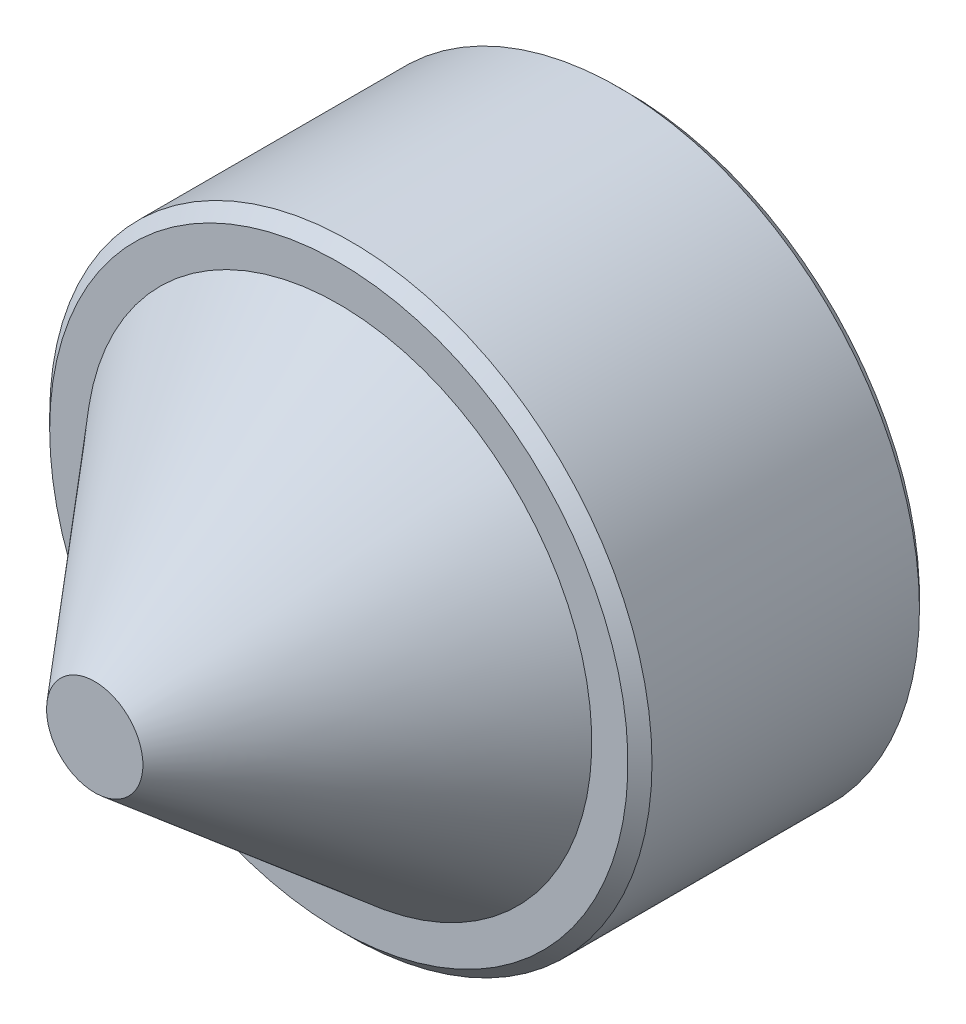
ISO-10303-21;
HEADER;
FILE_DESCRIPTION(('STEP AP214'),'2;1');
FILE_NAME('part.step','',(''),(''),'','','');
FILE_SCHEMA(('AUTOMOTIVE_DESIGN { 1 0 10303 214 1 1 1 1 }'));
ENDSEC;
DATA;
#1=APPLICATION_CONTEXT('core data for automotive mechanical design processes');
#2=APPLICATION_PROTOCOL_DEFINITION('international standard','automotive_design',2000,#1);
#3=PRODUCT_CONTEXT('',#1,'mechanical');
#4=PRODUCT('Part','Part','',(#3));
#5=PRODUCT_RELATED_PRODUCT_CATEGORY('part','',(#4));
#6=PRODUCT_DEFINITION_FORMATION('','',#4);
#7=PRODUCT_DEFINITION_CONTEXT('part definition',#1,'design');
#8=PRODUCT_DEFINITION('design','',#6,#7);
#9=PRODUCT_DEFINITION_SHAPE('','',#8);
#10=(LENGTH_UNIT() NAMED_UNIT(*) SI_UNIT(.MILLI.,.METRE.));
#11=(NAMED_UNIT(*) PLANE_ANGLE_UNIT() SI_UNIT($,.RADIAN.));
#12=(NAMED_UNIT(*) SI_UNIT($,.STERADIAN.) SOLID_ANGLE_UNIT());
#13=UNCERTAINTY_MEASURE_WITH_UNIT(LENGTH_MEASURE(1.E-05),#10,'distance_accuracy_value','');
#14=(GEOMETRIC_REPRESENTATION_CONTEXT(3) GLOBAL_UNCERTAINTY_ASSIGNED_CONTEXT((#13)) GLOBAL_UNIT_ASSIGNED_CONTEXT((#10,
#11,#12)) REPRESENTATION_CONTEXT('',''));
#15=CARTESIAN_POINT('',(0.,0.,0.));
#16=DIRECTION('',(0.,0.,1.));
#17=DIRECTION('',(1.,0.,0.));
#18=AXIS2_PLACEMENT_3D('',#15,#16,#17);
#19=CARTESIAN_POINT('',(0.,0.,0.));
#20=DIRECTION('',(0.,0.,1.));
#21=DIRECTION('',(1.,0.,0.));
#22=AXIS2_PLACEMENT_3D('',#19,#20,#21);
#23=PLANE('',#22);
#24=CARTESIAN_POINT('',(0.,0.,0.));
#25=DIRECTION('',(0.,0.,1.));
#26=DIRECTION('',(1.,0.,0.));
#27=AXIS2_PLACEMENT_3D('',#24,#25,#26);
#28=CIRCLE('',#27,11.);
#29=CARTESIAN_POINT('',(-11.,0.,0.));
#30=VERTEX_POINT('',#29);
#31=EDGE_CURVE('E46',#30,#30,#28,.F.);
#32=ORIENTED_EDGE('',*,*,#31,.F.);
#33=EDGE_LOOP('',(#32));
#34=FACE_BOUND('',#33,.T.);
#35=CARTESIAN_POINT('',(0.,0.,0.));
#36=DIRECTION('',(0.,0.,-1.));
#37=DIRECTION('',(-1.,0.,0.));
#38=AXIS2_PLACEMENT_3D('',#35,#36,#37);
#39=CIRCLE('',#38,12.1);
#40=CARTESIAN_POINT('',(-12.1,0.,0.));
#41=VERTEX_POINT('',#40);
#42=EDGE_CURVE('E10',#41,#41,#39,.T.);
#43=ORIENTED_EDGE('',*,*,#42,.T.);
#44=EDGE_LOOP('',(#43));
#45=FACE_BOUND('',#44,.T.);
#46=ADVANCED_FACE('F43',(#34,#45),#23,.F.);
#47=CARTESIAN_POINT('',(0.,0.,0.400000000000178));
#48=DIRECTION('',(0.,0.,1.));
#49=DIRECTION('',(1.,0.,0.));
#50=AXIS2_PLACEMENT_3D('',#47,#48,#49);
#51=CONICAL_SURFACE('',#50,12.5,0.785398163397227);
#52=ORIENTED_EDGE('',*,*,#42,.F.);
#53=EDGE_LOOP('',(#52));
#54=FACE_BOUND('',#53,.T.);
#55=CARTESIAN_POINT('',(0.,0.,0.400000000000178));
#56=DIRECTION('',(0.,0.,-1.));
#57=DIRECTION('',(-1.,0.,0.));
#58=AXIS2_PLACEMENT_3D('',#55,#56,#57);
#59=CIRCLE('',#58,12.5);
#60=CARTESIAN_POINT('',(-12.5,0.,0.400000000000178));
#61=VERTEX_POINT('',#60);
#62=EDGE_CURVE('E51',#61,#61,#59,.T.);
#63=ORIENTED_EDGE('',*,*,#62,.T.);
#64=EDGE_LOOP('',(#63));
#65=FACE_BOUND('',#64,.T.);
#66=ADVANCED_FACE('F86',(#54,#65),#51,.T.);
#67=CARTESIAN_POINT('',(0.,0.,0.));
#68=DIRECTION('',(0.,0.,-1.));
#69=DIRECTION('',(-1.,0.,0.));
#70=AXIS2_PLACEMENT_3D('',#67,#68,#69);
#71=CYLINDRICAL_SURFACE('',#70,12.5);
#72=ORIENTED_EDGE('',*,*,#62,.F.);
#73=EDGE_LOOP('',(#72));
#74=FACE_BOUND('',#73,.T.);
#75=CARTESIAN_POINT('',(0.,0.,11.5000000000001));
#76=DIRECTION('',(0.,0.,-1.));
#77=DIRECTION('',(-1.,0.,0.));
#78=AXIS2_PLACEMENT_3D('',#75,#76,#77);
#79=CIRCLE('',#78,12.5);
#80=CARTESIAN_POINT('',(-12.5,0.,11.5000000000001));
#81=VERTEX_POINT('',#80);
#82=EDGE_CURVE('E56',#81,#81,#79,.T.);
#83=ORIENTED_EDGE('',*,*,#82,.T.);
#84=EDGE_LOOP('',(#83));
#85=FACE_BOUND('',#84,.T.);
#86=ADVANCED_FACE('F92',(#74,#85),#71,.T.);
#87=CARTESIAN_POINT('',(0.,0.,12.));
#88=DIRECTION('',(0.,0.,-1.));
#89=DIRECTION('',(-1.,0.,0.));
#90=AXIS2_PLACEMENT_3D('',#87,#88,#89);
#91=CONICAL_SURFACE('',#90,12.,0.785398163397504);
#92=ORIENTED_EDGE('',*,*,#82,.F.);
#93=EDGE_LOOP('',(#92));
#94=FACE_BOUND('',#93,.T.);
#95=CARTESIAN_POINT('',(0.,0.,12.));
#96=DIRECTION('',(0.,0.,-1.));
#97=DIRECTION('',(-1.,0.,0.));
#98=AXIS2_PLACEMENT_3D('',#95,#96,#97);
#99=CIRCLE('',#98,12.);
#100=CARTESIAN_POINT('',(-12.,0.,12.));
#101=VERTEX_POINT('',#100);
#102=EDGE_CURVE('E62',#101,#101,#99,.T.);
#103=ORIENTED_EDGE('',*,*,#102,.T.);
#104=EDGE_LOOP('',(#103));
#105=FACE_BOUND('',#104,.T.);
#106=ADVANCED_FACE('F97',(#94,#105),#91,.T.);
#107=CARTESIAN_POINT('',(12.,0.,12.));
#108=DIRECTION('',(0.,0.,-1.));
#109=DIRECTION('',(-1.,0.,0.));
#110=AXIS2_PLACEMENT_3D('',#107,#108,#109);
#111=PLANE('',#110);
#112=ORIENTED_EDGE('',*,*,#102,.F.);
#113=EDGE_LOOP('',(#112));
#114=FACE_BOUND('',#113,.T.);
#115=CARTESIAN_POINT('',(0.,0.,12.));
#116=DIRECTION('',(0.,0.,-1.));
#117=DIRECTION('',(-1.,0.,0.));
#118=AXIS2_PLACEMENT_3D('',#115,#116,#117);
#119=CIRCLE('',#118,10.5);
#120=CARTESIAN_POINT('',(-10.5,0.,12.));
#121=VERTEX_POINT('',#120);
#122=EDGE_CURVE('E66',#121,#121,#119,.T.);
#123=ORIENTED_EDGE('',*,*,#122,.T.);
#124=EDGE_LOOP('',(#123));
#125=FACE_BOUND('',#124,.T.);
#126=ADVANCED_FACE('F104',(#114,#125),#111,.F.);
#127=CARTESIAN_POINT('',(0.,0.,22.13));
#128=DIRECTION('',(0.,0.,-1.));
#129=DIRECTION('',(-1.,0.,0.));
#130=AXIS2_PLACEMENT_3D('',#127,#128,#129);
#131=CONICAL_SURFACE('',#130,2.,0.698127109079906);
#132=CARTESIAN_POINT('',(0.,0.,22.13));
#133=DIRECTION('',(0.,0.,-1.));
#134=DIRECTION('',(-1.,0.,0.));
#135=AXIS2_PLACEMENT_3D('',#132,#133,#134);
#136=CIRCLE('',#135,2.);
#137=CARTESIAN_POINT('',(-2.,0.,22.13));
#138=VERTEX_POINT('',#137);
#139=EDGE_CURVE('E70',#138,#138,#136,.T.);
#140=CARTESIAN_POINT('',(-10.5,0.,12.));
#141=CARTESIAN_POINT('',(-10.4114583333333,0.,12.1055208333333));
#142=CARTESIAN_POINT('',(-10.3229166666667,0.,12.2110416666667));
#143=CARTESIAN_POINT('',(-10.1458333333333,0.,12.4220833333333));
#144=CARTESIAN_POINT('',(-10.0572916666667,0.,12.5276041666667));
#145=CARTESIAN_POINT('',(-9.88020833333333,0.,12.7386458333333));
#146=CARTESIAN_POINT('',(-9.79166666666667,0.,12.8441666666667));
#147=CARTESIAN_POINT('',(-9.61458333333334,0.,13.0552083333333));
#148=CARTESIAN_POINT('',(-9.52604166666667,0.,13.1607291666667));
#149=CARTESIAN_POINT('',(-9.34895833333334,0.,13.3717708333333));
#150=CARTESIAN_POINT('',(-9.26041666666667,0.,13.4772916666667));
#151=CARTESIAN_POINT('',(-9.08333333333334,0.,13.6883333333333));
#152=CARTESIAN_POINT('',(-8.99479166666667,0.,13.7938541666667));
#153=CARTESIAN_POINT('',(-8.81770833333334,0.,14.0048958333333));
#154=CARTESIAN_POINT('',(-8.72916666666667,0.,14.1104166666667));
#155=CARTESIAN_POINT('',(-8.55208333333334,0.,14.3214583333333));
#156=CARTESIAN_POINT('',(-8.46354166666667,0.,14.4269791666667));
#157=CARTESIAN_POINT('',(-8.28645833333334,0.,14.6380208333333));
#158=CARTESIAN_POINT('',(-8.19791666666667,0.,14.7435416666667));
#159=CARTESIAN_POINT('',(-8.02083333333333,0.,14.9545833333333));
#160=CARTESIAN_POINT('',(-7.93229166666667,0.,15.0601041666667));
#161=CARTESIAN_POINT('',(-7.75520833333334,0.,15.2711458333333));
#162=CARTESIAN_POINT('',(-7.66666666666667,0.,15.3766666666667));
#163=CARTESIAN_POINT('',(-7.48958333333334,0.,15.5877083333333));
#164=CARTESIAN_POINT('',(-7.40104166666667,0.,15.6932291666667));
#165=CARTESIAN_POINT('',(-7.22395833333334,0.,15.9042708333333));
#166=CARTESIAN_POINT('',(-7.13541666666667,0.,16.0097916666667));
#167=CARTESIAN_POINT('',(-6.95833333333334,0.,16.2208333333333));
#168=CARTESIAN_POINT('',(-6.86979166666667,0.,16.3263541666667));
#169=CARTESIAN_POINT('',(-6.69270833333334,0.,16.5373958333333));
#170=CARTESIAN_POINT('',(-6.60416666666667,0.,16.6429166666667));
#171=CARTESIAN_POINT('',(-6.42708333333334,0.,16.8539583333333));
#172=CARTESIAN_POINT('',(-6.33854166666667,0.,16.9594791666667));
#173=CARTESIAN_POINT('',(-6.16145833333334,0.,17.1705208333333));
#174=CARTESIAN_POINT('',(-6.07291666666667,0.,17.2760416666667));
#175=CARTESIAN_POINT('',(-5.89583333333334,0.,17.4870833333333));
#176=CARTESIAN_POINT('',(-5.80729166666667,0.,17.5926041666667));
#177=CARTESIAN_POINT('',(-5.63020833333334,0.,17.8036458333333));
#178=CARTESIAN_POINT('',(-5.54166666666667,0.,17.9091666666667));
#179=CARTESIAN_POINT('',(-5.36458333333334,0.,18.1202083333333));
#180=CARTESIAN_POINT('',(-5.27604166666667,0.,18.2257291666667));
#181=CARTESIAN_POINT('',(-5.09895833333334,0.,18.4367708333333));
#182=CARTESIAN_POINT('',(-5.01041666666667,0.,18.5422916666667));
#183=CARTESIAN_POINT('',(-4.83333333333334,0.,18.7533333333333));
#184=CARTESIAN_POINT('',(-4.74479166666667,0.,18.8588541666667));
#185=CARTESIAN_POINT('',(-4.56770833333334,0.,19.0698958333333));
#186=CARTESIAN_POINT('',(-4.47916666666667,0.,19.1754166666667));
#187=CARTESIAN_POINT('',(-4.30208333333334,0.,19.3864583333333));
#188=CARTESIAN_POINT('',(-4.21354166666667,0.,19.4919791666667));
#189=CARTESIAN_POINT('',(-4.03645833333334,0.,19.7030208333333));
#190=CARTESIAN_POINT('',(-3.94791666666667,0.,19.8085416666667));
#191=CARTESIAN_POINT('',(-3.77083333333333,0.,20.0195833333333));
#192=CARTESIAN_POINT('',(-3.68229166666667,0.,20.1251041666667));
#193=CARTESIAN_POINT('',(-3.50520833333333,0.,20.3361458333333));
#194=CARTESIAN_POINT('',(-3.41666666666667,0.,20.4416666666667));
#195=CARTESIAN_POINT('',(-3.23958333333333,0.,20.6527083333333));
#196=CARTESIAN_POINT('',(-3.15104166666667,0.,20.7582291666667));
#197=CARTESIAN_POINT('',(-2.97395833333333,0.,20.9692708333333));
#198=CARTESIAN_POINT('',(-2.88541666666667,0.,21.0747916666667));
#199=CARTESIAN_POINT('',(-2.70833333333333,0.,21.2858333333333));
#200=CARTESIAN_POINT('',(-2.61979166666667,0.,21.3913541666667));
#201=CARTESIAN_POINT('',(-2.44270833333333,0.,21.6023958333333));
#202=CARTESIAN_POINT('',(-2.35416666666667,0.,21.7079166666666));
#203=CARTESIAN_POINT('',(-2.17708333333333,0.,21.9189583333333));
#204=CARTESIAN_POINT('',(-2.08854166666667,0.,22.0244791666666));
#205=CARTESIAN_POINT('',(-2.,0.,22.13));
#206=B_SPLINE_CURVE_WITH_KNOTS('',3,(#140,#141,#142,#143,#144,#145,#146,#147,#148,#149,#150,
#151,#152,#153,#154,#155,#156,#157,#158,#159,#160,#161,#162,#163,#164,#165,#166,#167,#168,#169,
#170,#171,#172,#173,#174,#175,#176,#177,#178,#179,#180,#181,#182,#183,#184,#185,#186,#187,#188,
#189,#190,#191,#192,#193,#194,#195,#196,#197,#198,#199,#200,#201,#202,#203,#204,#205),
.UNSPECIFIED.,.F.,.F.,(4,2,2,2,2,2,2,2,2,2,2,2,2,2,2,2,2,2,2,2,2,2,2,2,2,2,2,2,2,2,2,2,4),(0.,
0.413241402852193,0.826482805704389,1.23972420855658,1.65296561140878,2.06620701426097,
2.47944841711316,2.89268981996536,3.30593122281755,3.71917262566975,4.13241402852194,
4.54565543137414,4.95889683422633,5.37213823707852,5.78537963993072,6.19862104278291,
6.61186244563511,7.0251038484873,7.43834525133949,7.85158665419169,8.26482805704388,
8.67806945989608,9.09131086274827,9.50455226560047,9.91779366845266,10.3310350713049,
10.744276474157,11.1575178770092,11.5707592798614,11.9840006827136,12.3972420855658,
12.810483488418,13.2237248912702),.UNSPECIFIED.);
#207=EDGE_CURVE('BSEAM108',#121,#138,#206,.T.);
#208=ORIENTED_EDGE('',*,*,#122,.F.);
#209=ORIENTED_EDGE('',*,*,#139,.T.);
#210=ORIENTED_EDGE('',*,*,#207,.T.);
#211=ORIENTED_EDGE('',*,*,#207,.F.);
#212=EDGE_LOOP('',(#208,#210,#209,#211));
#213=FACE_BOUND('',#212,.T.);
#214=ADVANCED_FACE('F108',(#213),#131,.T.);
#215=CARTESIAN_POINT('',(2.,0.,22.13));
#216=DIRECTION('',(0.,0.,-1.));
#217=DIRECTION('',(-1.,0.,0.));
#218=AXIS2_PLACEMENT_3D('',#215,#216,#217);
#219=PLANE('',#218);
#220=ORIENTED_EDGE('',*,*,#139,.F.);
#221=EDGE_LOOP('',(#220));
#222=FACE_BOUND('',#221,.T.);
#223=ADVANCED_FACE('F112',(#222),#219,.F.);
#224=CARTESIAN_POINT('',(0.,0.,10.6300000000001));
#225=DIRECTION('',(0.,0.,-1.));
#226=DIRECTION('',(-1.,0.,0.));
#227=AXIS2_PLACEMENT_3D('',#224,#225,#226);
#228=CONICAL_SURFACE('',#227,2.08045409674235,0.698127109079898);
#229=CARTESIAN_POINT('',(0.,0.,10.6300000000001));
#230=DIRECTION('',(0.,0.,-1.));
#231=DIRECTION('',(-1.,0.,0.));
#232=AXIS2_PLACEMENT_3D('',#229,#230,#231);
#233=CIRCLE('',#232,2.08045409674235);
#234=CARTESIAN_POINT('',(-2.08045409674235,0.,10.6300000000001));
#235=VERTEX_POINT('',#234);
#236=EDGE_CURVE('E74',#235,#235,#233,.T.);
#237=CARTESIAN_POINT('',(-2.08045409674235,0.,10.6300000000001));
#238=CARTESIAN_POINT('',(-2.17336603323462,0.,10.5192708333335));
#239=CARTESIAN_POINT('',(-2.26627796972689,0.,10.4085416666668));
#240=CARTESIAN_POINT('',(-2.45210184271142,0.,10.1870833333335));
#241=CARTESIAN_POINT('',(-2.54501377920369,0.,10.0763541666668));
#242=CARTESIAN_POINT('',(-2.73083765218822,0.,9.85489583333346));
#243=CARTESIAN_POINT('',(-2.82374958868049,0.,9.74416666666679));
#244=CARTESIAN_POINT('',(-3.00957346166502,0.,9.52270833333346));
#245=CARTESIAN_POINT('',(-3.10248539815729,0.,9.41197916666679));
#246=CARTESIAN_POINT('',(-3.28830927114183,0.,9.19052083333345));
#247=CARTESIAN_POINT('',(-3.38122120763409,0.,9.07979166666679));
#248=CARTESIAN_POINT('',(-3.56704508061863,0.,8.85833333333345));
#249=CARTESIAN_POINT('',(-3.65995701711089,0.,8.74760416666678));
#250=CARTESIAN_POINT('',(-3.84578089009543,0.,8.52614583333344));
#251=CARTESIAN_POINT('',(-3.9386928265877,0.,8.41541666666678));
#252=CARTESIAN_POINT('',(-4.12451669957223,0.,8.19395833333344));
#253=CARTESIAN_POINT('',(-4.2174286360645,0.,8.08322916666677));
#254=CARTESIAN_POINT('',(-4.40325250904903,0.,7.86177083333344));
#255=CARTESIAN_POINT('',(-4.4961644455413,0.,7.75104166666677));
#256=CARTESIAN_POINT('',(-4.68198831852583,0.,7.52958333333343));
#257=CARTESIAN_POINT('',(-4.7749002550181,0.,7.41885416666676));
#258=CARTESIAN_POINT('',(-4.96072412800264,0.,7.19739583333343));
#259=CARTESIAN_POINT('',(-5.0536360644949,0.,7.08666666666676));
#260=CARTESIAN_POINT('',(-5.23945993747944,0.,6.86520833333342));
#261=CARTESIAN_POINT('',(-5.3323718739717,0.,6.75447916666676));
#262=CARTESIAN_POINT('',(-5.51819574695624,0.,6.53302083333342));
#263=CARTESIAN_POINT('',(-5.61110768344851,0.,6.42229166666675));
#264=CARTESIAN_POINT('',(-5.79693155643304,0.,6.20083333333342));
#265=CARTESIAN_POINT('',(-5.88984349292531,0.,6.09010416666675));
#266=CARTESIAN_POINT('',(-6.07566736590984,0.,5.86864583333341));
#267=CARTESIAN_POINT('',(-6.16857930240211,0.,5.75791666666674));
#268=CARTESIAN_POINT('',(-6.35440317538664,0.,5.53645833333341));
#269=CARTESIAN_POINT('',(-6.44731511187891,0.,5.42572916666674));
#270=CARTESIAN_POINT('',(-6.63313898486345,0.,5.2042708333334));
#271=CARTESIAN_POINT('',(-6.72605092135571,0.,5.09354166666673));
#272=CARTESIAN_POINT('',(-6.91187479434025,0.,4.8720833333334));
#273=CARTESIAN_POINT('',(-7.00478673083251,0.,4.76135416666673));
#274=CARTESIAN_POINT('',(-7.19061060381705,0.,4.53989583333339));
#275=CARTESIAN_POINT('',(-7.28352254030932,0.,4.42916666666672));
#276=CARTESIAN_POINT('',(-7.46934641329385,0.,4.20770833333339));
#277=CARTESIAN_POINT('',(-7.56225834978612,0.,4.09697916666672));
#278=CARTESIAN_POINT('',(-7.74808222277065,0.,3.87552083333338));
#279=CARTESIAN_POINT('',(-7.84099415926292,0.,3.76479166666672));
#280=CARTESIAN_POINT('',(-8.02681803224745,0.,3.54333333333338));
#281=CARTESIAN_POINT('',(-8.11972996873972,0.,3.43260416666671));
#282=CARTESIAN_POINT('',(-8.30555384172426,0.,3.21114583333338));
#283=CARTESIAN_POINT('',(-8.39846577821652,0.,3.10041666666671));
#284=CARTESIAN_POINT('',(-8.58428965120106,0.,2.87895833333337));
#285=CARTESIAN_POINT('',(-8.67720158769333,0.,2.7682291666667));
#286=CARTESIAN_POINT('',(-8.86302546067786,0.,2.54677083333337));
#287=CARTESIAN_POINT('',(-8.95593739717013,0.,2.4360416666667));
#288=CARTESIAN_POINT('',(-9.14176127015466,0.,2.21458333333336));
#289=CARTESIAN_POINT('',(-9.23467320664693,0.,2.10385416666669));
#290=CARTESIAN_POINT('',(-9.42049707963146,0.,1.88239583333336));
#291=CARTESIAN_POINT('',(-9.51340901612373,0.,1.77166666666669));
#292=CARTESIAN_POINT('',(-9.69923288910826,0.,1.55020833333335));
#293=CARTESIAN_POINT('',(-9.79214482560053,0.,1.43947916666669));
#294=CARTESIAN_POINT('',(-9.97796869858507,0.,1.21802083333335));
#295=CARTESIAN_POINT('',(-10.0708806350773,0.,1.10729166666668));
#296=CARTESIAN_POINT('',(-10.2567045080619,0.,0.885833333333345));
#297=CARTESIAN_POINT('',(-10.3496164445541,0.,0.775104166666677));
#298=CARTESIAN_POINT('',(-10.5354403175387,0.,0.55364583333334));
#299=CARTESIAN_POINT('',(-10.6283522540309,0.,0.442916666666672));
#300=CARTESIAN_POINT('',(-10.8141761270155,0.,0.221458333333337));
#301=CARTESIAN_POINT('',(-10.9070880635077,0.,0.110729166666669));
#302=CARTESIAN_POINT('',(-11.,0.,0.));
#303=B_SPLINE_CURVE_WITH_KNOTS('',3,(#237,#238,#239,#240,#241,#242,#243,#244,#245,#246,#247,
#248,#249,#250,#251,#252,#253,#254,#255,#256,#257,#258,#259,#260,#261,#262,#263,#264,#265,#266,
#267,#268,#269,#270,#271,#272,#273,#274,#275,#276,#277,#278,#279,#280,#281,#282,#283,#284,#285,
#286,#287,#288,#289,#290,#291,#292,#293,#294,#295,#296,#297,#298,#299,#300,#301,#302),
.UNSPECIFIED.,.F.,.F.,(4,2,2,2,2,2,2,2,2,2,2,2,2,2,2,2,2,2,2,2,2,2,2,2,2,2,2,2,2,2,2,2,4),(0.,
0.433638313160796,0.867276626321593,1.30091493948239,1.73455325264319,2.16819156580398,
2.60182987896478,3.03546819212557,3.46910650528637,3.90274481844717,4.33638313160796,
4.77002144476876,5.20365975792955,5.63729807109035,6.07093638425115,6.50457469741194,
6.93821301057274,7.37185132373353,7.80548963689433,8.23912795005513,8.67276626321592,
9.10640457637672,9.54004288953752,9.97368120269831,10.4073195158591,10.8409578290199,
11.2745961421807,11.7082344553415,12.1418727685023,12.5755110816631,13.0091493948239,
13.4427877079847,13.8764260211455),.UNSPECIFIED.);
#304=EDGE_CURVE('BSEAM83',#235,#30,#303,.T.);
#305=ORIENTED_EDGE('',*,*,#236,.F.);
#306=ORIENTED_EDGE('',*,*,#31,.T.);
#307=ORIENTED_EDGE('',*,*,#304,.T.);
#308=ORIENTED_EDGE('',*,*,#304,.F.);
#309=EDGE_LOOP('',(#305,#307,#306,#308));
#310=FACE_BOUND('',#309,.T.);
#311=ADVANCED_FACE('F83',(#310),#228,.F.);
#312=CARTESIAN_POINT('',(2.08045409674235,0.,10.6300000000001));
#313=DIRECTION('',(0.,0.,-1.));
#314=DIRECTION('',(-1.,0.,0.));
#315=AXIS2_PLACEMENT_3D('',#312,#313,#314);
#316=PLANE('',#315);
#317=ORIENTED_EDGE('',*,*,#236,.T.);
#318=EDGE_LOOP('',(#317));
#319=FACE_BOUND('',#318,.T.);
#320=ADVANCED_FACE('F117',(#319),#316,.T.);
#321=CLOSED_SHELL('',(#46,#66,#86,#106,#126,#214,#223,#311,#320));
#322=MANIFOLD_SOLID_BREP('B2',#321);
#323=ADVANCED_BREP_SHAPE_REPRESENTATION('',(#18,#322),#14);
#324=SHAPE_DEFINITION_REPRESENTATION(#9,#323);
ENDSEC;
END-ISO-10303-21;
